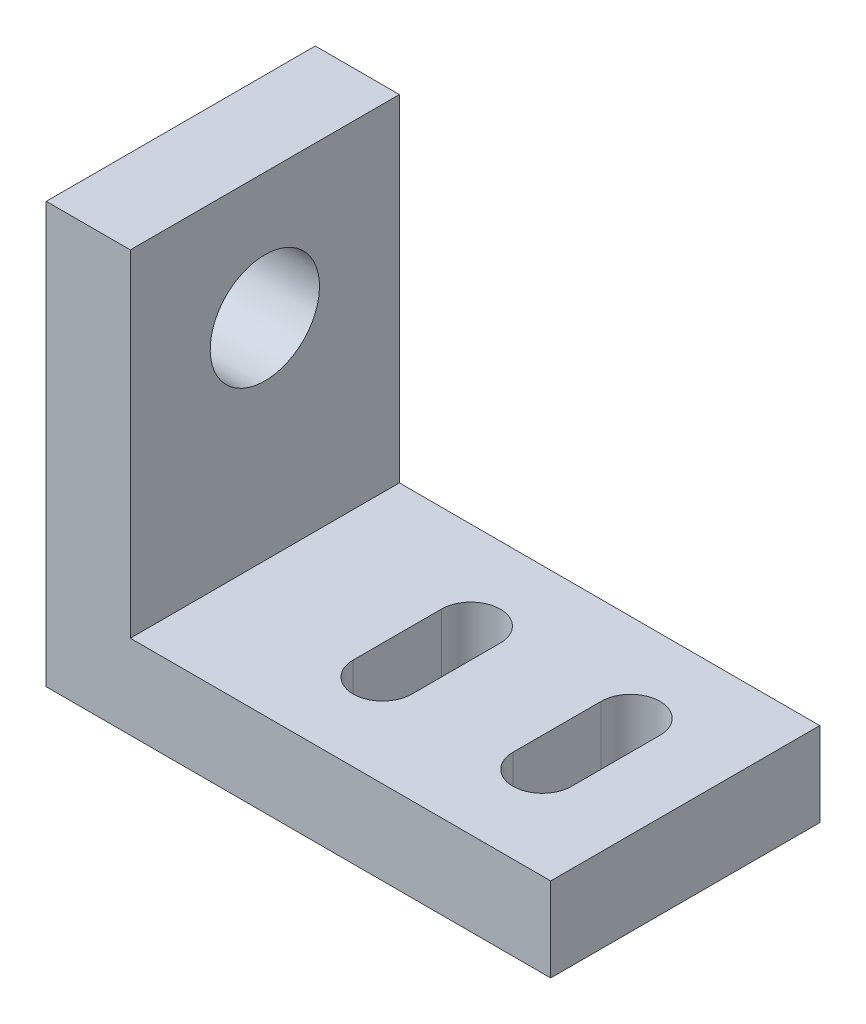
ISO-10303-21;
HEADER;
FILE_DESCRIPTION(('STEP AP214'),'2;1');
FILE_NAME('part.step','',(''),(''),'','','');
FILE_SCHEMA(('AUTOMOTIVE_DESIGN { 1 0 10303 214 1 1 1 1 }'));
ENDSEC;
DATA;
#1=APPLICATION_CONTEXT('core data for automotive mechanical design processes');
#2=APPLICATION_PROTOCOL_DEFINITION('international standard','automotive_design',2000,#1);
#3=PRODUCT_CONTEXT('',#1,'mechanical');
#4=PRODUCT('Part','Part','',(#3));
#5=PRODUCT_RELATED_PRODUCT_CATEGORY('part','',(#4));
#6=PRODUCT_DEFINITION_FORMATION('','',#4);
#7=PRODUCT_DEFINITION_CONTEXT('part definition',#1,'design');
#8=PRODUCT_DEFINITION('design','',#6,#7);
#9=PRODUCT_DEFINITION_SHAPE('','',#8);
#10=(LENGTH_UNIT() NAMED_UNIT(*) SI_UNIT(.MILLI.,.METRE.));
#11=(NAMED_UNIT(*) PLANE_ANGLE_UNIT() SI_UNIT($,.RADIAN.));
#12=(NAMED_UNIT(*) SI_UNIT($,.STERADIAN.) SOLID_ANGLE_UNIT());
#13=UNCERTAINTY_MEASURE_WITH_UNIT(LENGTH_MEASURE(1.E-05),#10,'distance_accuracy_value','');
#14=(GEOMETRIC_REPRESENTATION_CONTEXT(3) GLOBAL_UNCERTAINTY_ASSIGNED_CONTEXT((#13)) GLOBAL_UNIT_ASSIGNED_CONTEXT((#10,
#11,#12)) REPRESENTATION_CONTEXT('',''));
#15=CARTESIAN_POINT('',(0.,0.,0.));
#16=DIRECTION('',(0.,0.,1.));
#17=DIRECTION('',(1.,0.,0.));
#18=AXIS2_PLACEMENT_3D('',#15,#16,#17);
#19=CARTESIAN_POINT('',(-5.,20.,16.));
#20=DIRECTION('',(0.,-1.,0.));
#21=DIRECTION('',(1.,0.,0.));
#22=AXIS2_PLACEMENT_3D('',#19,#20,#21);
#23=PLANE('',#22);
#24=DIRECTION('',(-1.,0.,0.));
#25=VECTOR('',#24,1.);
#26=CARTESIAN_POINT('',(-5.,20.,0.));
#27=LINE('',#26,#25);
#28=CARTESIAN_POINT('',(0.,20.,0.));
#29=VERTEX_POINT('',#28);
#30=CARTESIAN_POINT('',(-5.,20.,0.));
#31=VERTEX_POINT('',#30);
#32=EDGE_CURVE('E290',#29,#31,#27,.T.);
#33=ORIENTED_EDGE('',*,*,#32,.T.);
#34=DIRECTION('',(0.,0.,-1.));
#35=VECTOR('',#34,1.);
#36=CARTESIAN_POINT('',(-5.,20.,16.));
#37=LINE('',#36,#35);
#38=CARTESIAN_POINT('',(-5.,20.,16.));
#39=VERTEX_POINT('',#38);
#40=EDGE_CURVE('E331',#39,#31,#37,.T.);
#41=ORIENTED_EDGE('',*,*,#40,.F.);
#42=DIRECTION('',(-1.,0.,0.));
#43=VECTOR('',#42,1.);
#44=CARTESIAN_POINT('',(-5.,20.,16.));
#45=LINE('',#44,#43);
#46=CARTESIAN_POINT('',(0.,20.,16.));
#47=VERTEX_POINT('',#46);
#48=EDGE_CURVE('E291',#47,#39,#45,.T.);
#49=ORIENTED_EDGE('',*,*,#48,.F.);
#50=DIRECTION('',(0.,0.,-1.));
#51=VECTOR('',#50,1.);
#52=CARTESIAN_POINT('',(0.,20.,16.));
#53=LINE('',#52,#51);
#54=EDGE_CURVE('E305',#47,#29,#53,.T.);
#55=ORIENTED_EDGE('',*,*,#54,.T.);
#56=EDGE_LOOP('',(#33,#41,#49,#55));
#57=FACE_BOUND('',#56,.T.);
#58=ADVANCED_FACE('F34',(#57),#23,.F.);
#59=CARTESIAN_POINT('',(-5.,20.,16.));
#60=DIRECTION('',(1.,0.,0.));
#61=DIRECTION('',(0.,1.,0.));
#62=AXIS2_PLACEMENT_3D('',#59,#60,#61);
#63=PLANE('',#62);
#64=CARTESIAN_POINT('',(-5.,12.5,8.));
#65=DIRECTION('',(1.,0.,0.));
#66=DIRECTION('',(0.,1.,0.));
#67=AXIS2_PLACEMENT_3D('',#64,#65,#66);
#68=CIRCLE('',#67,3.25);
#69=CARTESIAN_POINT('',(-5.,15.75,8.));
#70=VERTEX_POINT('',#69);
#71=EDGE_CURVE('E226',#70,#70,#68,.T.);
#72=ORIENTED_EDGE('',*,*,#71,.T.);
#73=EDGE_LOOP('',(#72));
#74=FACE_BOUND('',#73,.T.);
#75=DIRECTION('',(0.,-1.,0.));
#76=VECTOR('',#75,1.);
#77=CARTESIAN_POINT('',(-5.,20.,0.));
#78=LINE('',#77,#76);
#79=CARTESIAN_POINT('',(-5.,-5.,0.));
#80=VERTEX_POINT('',#79);
#81=EDGE_CURVE('E308',#31,#80,#78,.T.);
#82=ORIENTED_EDGE('',*,*,#81,.T.);
#83=DIRECTION('',(0.,0.,-1.));
#84=VECTOR('',#83,1.);
#85=CARTESIAN_POINT('',(-5.,-5.,16.));
#86=LINE('',#85,#84);
#87=CARTESIAN_POINT('',(-5.,-5.,16.));
#88=VERTEX_POINT('',#87);
#89=EDGE_CURVE('E328',#88,#80,#86,.T.);
#90=ORIENTED_EDGE('',*,*,#89,.F.);
#91=DIRECTION('',(0.,-1.,0.));
#92=VECTOR('',#91,1.);
#93=CARTESIAN_POINT('',(-5.,20.,16.));
#94=LINE('',#93,#92);
#95=EDGE_CURVE('E294',#39,#88,#94,.T.);
#96=ORIENTED_EDGE('',*,*,#95,.F.);
#97=ORIENTED_EDGE('',*,*,#40,.T.);
#98=EDGE_LOOP('',(#82,#90,#96,#97));
#99=FACE_BOUND('',#98,.T.);
#100=ADVANCED_FACE('F369',(#74,#99),#63,.F.);
#101=CARTESIAN_POINT('',(-5.,-5.,16.));
#102=DIRECTION('',(0.,1.,0.));
#103=DIRECTION('',(0.,0.,1.));
#104=AXIS2_PLACEMENT_3D('',#101,#102,#103);
#105=PLANE('',#104);
#106=DIRECTION('',(0.,0.,-1.));
#107=VECTOR('',#106,1.);
#108=CARTESIAN_POINT('',(20.7694812656682,-5.,16.));
#109=LINE('',#108,#107);
#110=CARTESIAN_POINT('',(20.7694812656682,-5.,10.5));
#111=VERTEX_POINT('',#110);
#112=CARTESIAN_POINT('',(20.7694812656682,-5.,5.25));
#113=VERTEX_POINT('',#112);
#114=EDGE_CURVE('E41',#111,#113,#109,.T.);
#115=ORIENTED_EDGE('',*,*,#114,.T.);
#116=CARTESIAN_POINT('',(19.0004993468507,-5.,5.25));
#117=DIRECTION('',(0.,1.,0.));
#118=DIRECTION('',(0.,0.,1.));
#119=AXIS2_PLACEMENT_3D('',#116,#117,#118);
#120=CIRCLE('',#119,1.76898191881743);
#121=CARTESIAN_POINT('',(17.2315174280333,-5.,5.25));
#122=VERTEX_POINT('',#121);
#123=EDGE_CURVE('E11',#113,#122,#120,.T.);
#124=ORIENTED_EDGE('',*,*,#123,.T.);
#125=DIRECTION('',(0.,0.,1.));
#126=VECTOR('',#125,1.);
#127=CARTESIAN_POINT('',(17.2315174280333,-5.,16.));
#128=LINE('',#127,#126);
#129=CARTESIAN_POINT('',(17.2315174280333,-5.,10.5));
#130=VERTEX_POINT('',#129);
#131=EDGE_CURVE('E185',#122,#130,#128,.T.);
#132=ORIENTED_EDGE('',*,*,#131,.T.);
#133=CARTESIAN_POINT('',(19.0004993468507,-5.,10.5));
#134=DIRECTION('',(0.,1.,0.));
#135=DIRECTION('',(0.,0.,1.));
#136=AXIS2_PLACEMENT_3D('',#133,#134,#135);
#137=CIRCLE('',#136,1.76898191881743);
#138=EDGE_CURVE('E349',#130,#111,#137,.T.);
#139=ORIENTED_EDGE('',*,*,#138,.T.);
#140=EDGE_LOOP('',(#115,#124,#132,#139));
#141=FACE_BOUND('',#140,.T.);
#142=DIRECTION('',(0.,0.,-1.));
#143=VECTOR('',#142,1.);
#144=CARTESIAN_POINT('',(11.2689819188174,-5.,16.));
#145=LINE('',#144,#143);
#146=CARTESIAN_POINT('',(11.2689819188174,-5.,10.5));
#147=VERTEX_POINT('',#146);
#148=CARTESIAN_POINT('',(11.2689819188174,-5.,5.25));
#149=VERTEX_POINT('',#148);
#150=EDGE_CURVE('E342',#147,#149,#145,.T.);
#151=ORIENTED_EDGE('',*,*,#150,.T.);
#152=CARTESIAN_POINT('',(9.5,-5.,5.25));
#153=DIRECTION('',(0.,1.,0.));
#154=DIRECTION('',(0.,0.,1.));
#155=AXIS2_PLACEMENT_3D('',#152,#153,#154);
#156=CIRCLE('',#155,1.76898191881743);
#157=CARTESIAN_POINT('',(7.73101808118257,-5.,5.25));
#158=VERTEX_POINT('',#157);
#159=EDGE_CURVE('E345',#149,#158,#156,.T.);
#160=ORIENTED_EDGE('',*,*,#159,.T.);
#161=DIRECTION('',(0.,0.,1.));
#162=VECTOR('',#161,1.);
#163=CARTESIAN_POINT('',(7.73101808118257,-5.,16.));
#164=LINE('',#163,#162);
#165=CARTESIAN_POINT('',(7.73101808118257,-5.,10.5));
#166=VERTEX_POINT('',#165);
#167=EDGE_CURVE('E334',#158,#166,#164,.T.);
#168=ORIENTED_EDGE('',*,*,#167,.T.);
#169=CARTESIAN_POINT('',(9.5,-5.,10.5));
#170=DIRECTION('',(0.,1.,0.));
#171=DIRECTION('',(0.,0.,1.));
#172=AXIS2_PLACEMENT_3D('',#169,#170,#171);
#173=CIRCLE('',#172,1.76898191881743);
#174=EDGE_CURVE('E339',#166,#147,#173,.T.);
#175=ORIENTED_EDGE('',*,*,#174,.T.);
#176=EDGE_LOOP('',(#151,#160,#168,#175));
#177=FACE_BOUND('',#176,.T.);
#178=DIRECTION('',(1.,0.,0.));
#179=VECTOR('',#178,1.);
#180=CARTESIAN_POINT('',(-5.,-5.,0.));
#181=LINE('',#180,#179);
#182=CARTESIAN_POINT('',(25.,-5.,0.));
#183=VERTEX_POINT('',#182);
#184=EDGE_CURVE('E310',#80,#183,#181,.T.);
#185=ORIENTED_EDGE('',*,*,#184,.T.);
#186=DIRECTION('',(0.,0.,-1.));
#187=VECTOR('',#186,1.);
#188=CARTESIAN_POINT('',(25.,-5.,16.));
#189=LINE('',#188,#187);
#190=CARTESIAN_POINT('',(25.,-5.,16.));
#191=VERTEX_POINT('',#190);
#192=EDGE_CURVE('E325',#191,#183,#189,.T.);
#193=ORIENTED_EDGE('',*,*,#192,.F.);
#194=DIRECTION('',(1.,0.,0.));
#195=VECTOR('',#194,1.);
#196=CARTESIAN_POINT('',(-5.,-5.,16.));
#197=LINE('',#196,#195);
#198=EDGE_CURVE('E297',#88,#191,#197,.T.);
#199=ORIENTED_EDGE('',*,*,#198,.F.);
#200=ORIENTED_EDGE('',*,*,#89,.T.);
#201=EDGE_LOOP('',(#185,#193,#199,#200));
#202=FACE_BOUND('',#201,.T.);
#203=ADVANCED_FACE('F353',(#141,#177,#202),#105,.F.);
#204=CARTESIAN_POINT('',(25.,0.,16.));
#205=DIRECTION('',(-1.,0.,0.));
#206=DIRECTION('',(0.,0.,1.));
#207=AXIS2_PLACEMENT_3D('',#204,#205,#206);
#208=PLANE('',#207);
#209=DIRECTION('',(0.,1.,0.));
#210=VECTOR('',#209,1.);
#211=CARTESIAN_POINT('',(25.,0.,0.));
#212=LINE('',#211,#210);
#213=CARTESIAN_POINT('',(25.,0.,0.));
#214=VERTEX_POINT('',#213);
#215=EDGE_CURVE('E312',#183,#214,#212,.T.);
#216=ORIENTED_EDGE('',*,*,#215,.T.);
#217=DIRECTION('',(0.,0.,-1.));
#218=VECTOR('',#217,1.);
#219=CARTESIAN_POINT('',(25.,0.,16.));
#220=LINE('',#219,#218);
#221=CARTESIAN_POINT('',(25.,0.,16.));
#222=VERTEX_POINT('',#221);
#223=EDGE_CURVE('E322',#222,#214,#220,.T.);
#224=ORIENTED_EDGE('',*,*,#223,.F.);
#225=DIRECTION('',(0.,1.,0.));
#226=VECTOR('',#225,1.);
#227=CARTESIAN_POINT('',(25.,0.,16.));
#228=LINE('',#227,#226);
#229=EDGE_CURVE('E299',#191,#222,#228,.T.);
#230=ORIENTED_EDGE('',*,*,#229,.F.);
#231=ORIENTED_EDGE('',*,*,#192,.T.);
#232=EDGE_LOOP('',(#216,#224,#230,#231));
#233=FACE_BOUND('',#232,.T.);
#234=ADVANCED_FACE('F399',(#233),#208,.F.);
#235=CARTESIAN_POINT('',(0.,0.,16.));
#236=DIRECTION('',(0.,-1.,0.));
#237=DIRECTION('',(1.,0.,0.));
#238=AXIS2_PLACEMENT_3D('',#235,#236,#237);
#239=PLANE('',#238);
#240=DIRECTION('',(0.,0.,1.));
#241=VECTOR('',#240,1.);
#242=CARTESIAN_POINT('',(17.25,0.,5.25));
#243=LINE('',#242,#241);
#244=CARTESIAN_POINT('',(17.25,0.,5.25));
#245=VERTEX_POINT('',#244);
#246=CARTESIAN_POINT('',(17.25,0.,10.5));
#247=VERTEX_POINT('',#246);
#248=EDGE_CURVE('E243',#245,#247,#243,.T.);
#249=ORIENTED_EDGE('',*,*,#248,.F.);
#250=CARTESIAN_POINT('',(19.,0.,5.25));
#251=DIRECTION('',(0.,1.,0.));
#252=DIRECTION('',(-1.,0.,0.));
#253=AXIS2_PLACEMENT_3D('',#250,#251,#252);
#254=CIRCLE('',#253,1.75);
#255=CARTESIAN_POINT('',(20.75,0.,5.25));
#256=VERTEX_POINT('',#255);
#257=EDGE_CURVE('E241',#256,#245,#254,.T.);
#258=ORIENTED_EDGE('',*,*,#257,.F.);
#259=DIRECTION('',(0.,0.,-1.));
#260=VECTOR('',#259,1.);
#261=CARTESIAN_POINT('',(20.75,0.,5.25));
#262=LINE('',#261,#260);
#263=CARTESIAN_POINT('',(20.75,0.,10.5));
#264=VERTEX_POINT('',#263);
#265=EDGE_CURVE('E234',#264,#256,#262,.T.);
#266=ORIENTED_EDGE('',*,*,#265,.F.);
#267=CARTESIAN_POINT('',(19.,0.,10.5));
#268=DIRECTION('',(0.,1.,0.));
#269=DIRECTION('',(-1.,0.,0.));
#270=AXIS2_PLACEMENT_3D('',#267,#268,#269);
#271=CIRCLE('',#270,1.75);
#272=EDGE_CURVE('E246',#247,#264,#271,.T.);
#273=ORIENTED_EDGE('',*,*,#272,.F.);
#274=EDGE_LOOP('',(#249,#258,#266,#273));
#275=FACE_BOUND('',#274,.T.);
#276=DIRECTION('',(0.,0.,1.));
#277=VECTOR('',#276,1.);
#278=CARTESIAN_POINT('',(7.75,0.,5.25));
#279=LINE('',#278,#277);
#280=CARTESIAN_POINT('',(7.75,0.,5.25));
#281=VERTEX_POINT('',#280);
#282=CARTESIAN_POINT('',(7.75,0.,10.5));
#283=VERTEX_POINT('',#282);
#284=EDGE_CURVE('E271',#281,#283,#279,.T.);
#285=ORIENTED_EDGE('',*,*,#284,.F.);
#286=CARTESIAN_POINT('',(9.5,0.,5.25));
#287=DIRECTION('',(0.,1.,0.));
#288=DIRECTION('',(-1.,0.,0.));
#289=AXIS2_PLACEMENT_3D('',#286,#287,#288);
#290=CIRCLE('',#289,1.75);
#291=CARTESIAN_POINT('',(11.25,0.,5.25));
#292=VERTEX_POINT('',#291);
#293=EDGE_CURVE('E253',#292,#281,#290,.T.);
#294=ORIENTED_EDGE('',*,*,#293,.F.);
#295=DIRECTION('',(0.,0.,-1.));
#296=VECTOR('',#295,1.);
#297=CARTESIAN_POINT('',(11.25,0.,5.25));
#298=LINE('',#297,#296);
#299=CARTESIAN_POINT('',(11.25,0.,10.5));
#300=VERTEX_POINT('',#299);
#301=EDGE_CURVE('E263',#300,#292,#298,.T.);
#302=ORIENTED_EDGE('',*,*,#301,.F.);
#303=CARTESIAN_POINT('',(9.5,0.,10.5));
#304=DIRECTION('',(0.,1.,0.));
#305=DIRECTION('',(-1.,0.,0.));
#306=AXIS2_PLACEMENT_3D('',#303,#304,#305);
#307=CIRCLE('',#306,1.75);
#308=EDGE_CURVE('E274',#283,#300,#307,.T.);
#309=ORIENTED_EDGE('',*,*,#308,.F.);
#310=EDGE_LOOP('',(#285,#294,#302,#309));
#311=FACE_BOUND('',#310,.T.);
#312=DIRECTION('',(-1.,0.,0.));
#313=VECTOR('',#312,1.);
#314=CARTESIAN_POINT('',(0.,0.,0.));
#315=LINE('',#314,#313);
#316=CARTESIAN_POINT('',(0.,0.,0.));
#317=VERTEX_POINT('',#316);
#318=EDGE_CURVE('E314',#214,#317,#315,.T.);
#319=ORIENTED_EDGE('',*,*,#318,.T.);
#320=DIRECTION('',(0.,0.,-1.));
#321=VECTOR('',#320,1.);
#322=CARTESIAN_POINT('',(0.,0.,16.));
#323=LINE('',#322,#321);
#324=CARTESIAN_POINT('',(0.,0.,16.));
#325=VERTEX_POINT('',#324);
#326=EDGE_CURVE('E319',#325,#317,#323,.T.);
#327=ORIENTED_EDGE('',*,*,#326,.F.);
#328=DIRECTION('',(-1.,0.,0.));
#329=VECTOR('',#328,1.);
#330=CARTESIAN_POINT('',(0.,0.,16.));
#331=LINE('',#330,#329);
#332=EDGE_CURVE('E301',#222,#325,#331,.T.);
#333=ORIENTED_EDGE('',*,*,#332,.F.);
#334=ORIENTED_EDGE('',*,*,#223,.T.);
#335=EDGE_LOOP('',(#319,#327,#333,#334));
#336=FACE_BOUND('',#335,.T.);
#337=ADVANCED_FACE('F396',(#275,#311,#336),#239,.F.);
#338=CARTESIAN_POINT('',(0.,20.,16.));
#339=DIRECTION('',(-1.,0.,0.));
#340=DIRECTION('',(0.,-1.,0.));
#341=AXIS2_PLACEMENT_3D('',#338,#339,#340);
#342=PLANE('',#341);
#343=CARTESIAN_POINT('',(0.,12.5,8.));
#344=DIRECTION('',(1.,0.,0.));
#345=DIRECTION('',(0.,1.,0.));
#346=AXIS2_PLACEMENT_3D('',#343,#344,#345);
#347=CIRCLE('',#346,3.25);
#348=CARTESIAN_POINT('',(0.,15.75,8.));
#349=VERTEX_POINT('',#348);
#350=EDGE_CURVE('E281',#349,#349,#347,.T.);
#351=ORIENTED_EDGE('',*,*,#350,.F.);
#352=EDGE_LOOP('',(#351));
#353=FACE_BOUND('',#352,.T.);
#354=DIRECTION('',(0.,1.,0.));
#355=VECTOR('',#354,1.);
#356=CARTESIAN_POINT('',(0.,20.,0.));
#357=LINE('',#356,#355);
#358=EDGE_CURVE('E295',#317,#29,#357,.T.);
#359=ORIENTED_EDGE('',*,*,#358,.T.);
#360=ORIENTED_EDGE('',*,*,#54,.F.);
#361=DIRECTION('',(0.,1.,0.));
#362=VECTOR('',#361,1.);
#363=CARTESIAN_POINT('',(0.,20.,16.));
#364=LINE('',#363,#362);
#365=EDGE_CURVE('E303',#325,#47,#364,.T.);
#366=ORIENTED_EDGE('',*,*,#365,.F.);
#367=ORIENTED_EDGE('',*,*,#326,.T.);
#368=EDGE_LOOP('',(#359,#360,#366,#367));
#369=FACE_BOUND('',#368,.T.);
#370=ADVANCED_FACE('F394',(#353,#369),#342,.F.);
#371=CARTESIAN_POINT('',(0.,0.,16.));
#372=DIRECTION('',(0.,0.,-1.));
#373=DIRECTION('',(-1.,0.,0.));
#374=AXIS2_PLACEMENT_3D('',#371,#372,#373);
#375=PLANE('',#374);
#376=ORIENTED_EDGE('',*,*,#48,.T.);
#377=ORIENTED_EDGE('',*,*,#95,.T.);
#378=ORIENTED_EDGE('',*,*,#198,.T.);
#379=ORIENTED_EDGE('',*,*,#229,.T.);
#380=ORIENTED_EDGE('',*,*,#332,.T.);
#381=ORIENTED_EDGE('',*,*,#365,.T.);
#382=EDGE_LOOP('',(#376,#377,#378,#379,#380,#381));
#383=FACE_BOUND('',#382,.T.);
#384=ADVANCED_FACE('F389',(#383),#375,.F.);
#385=CARTESIAN_POINT('',(0.,0.,0.));
#386=DIRECTION('',(0.,0.,-1.));
#387=DIRECTION('',(-1.,0.,0.));
#388=AXIS2_PLACEMENT_3D('',#385,#386,#387);
#389=PLANE('',#388);
#390=ORIENTED_EDGE('',*,*,#32,.F.);
#391=ORIENTED_EDGE('',*,*,#358,.F.);
#392=ORIENTED_EDGE('',*,*,#318,.F.);
#393=ORIENTED_EDGE('',*,*,#215,.F.);
#394=ORIENTED_EDGE('',*,*,#184,.F.);
#395=ORIENTED_EDGE('',*,*,#81,.F.);
#396=EDGE_LOOP('',(#390,#391,#392,#393,#394,#395));
#397=FACE_BOUND('',#396,.T.);
#398=ADVANCED_FACE('F381',(#397),#389,.T.);
#399=CARTESIAN_POINT('',(-4.,12.5,8.));
#400=DIRECTION('',(1.,0.,0.));
#401=DIRECTION('',(0.,1.,0.));
#402=AXIS2_PLACEMENT_3D('',#399,#400,#401);
#403=CYLINDRICAL_SURFACE('',#402,3.25);
#404=ORIENTED_EDGE('',*,*,#350,.T.);
#405=EDGE_LOOP('',(#404));
#406=FACE_BOUND('',#405,.T.);
#407=ORIENTED_EDGE('',*,*,#71,.F.);
#408=EDGE_LOOP('',(#407));
#409=FACE_BOUND('',#408,.T.);
#410=ADVANCED_FACE('F418',(#406,#409),#403,.F.);
#411=CARTESIAN_POINT('',(9.5,-4.,5.25));
#412=DIRECTION('',(0.,1.,0.));
#413=DIRECTION('',(-1.,0.,0.));
#414=AXIS2_PLACEMENT_3D('',#411,#412,#413);
#415=CYLINDRICAL_SURFACE('',#414,1.75);
#416=ORIENTED_EDGE('',*,*,#293,.T.);
#417=DIRECTION('',(0.,1.,0.));
#418=VECTOR('',#417,1.);
#419=CARTESIAN_POINT('',(7.75,-4.,5.25));
#420=LINE('',#419,#418);
#421=CARTESIAN_POINT('',(7.75,-4.,5.25));
#422=VERTEX_POINT('',#421);
#423=EDGE_CURVE('E269',#422,#281,#420,.T.);
#424=ORIENTED_EDGE('',*,*,#423,.F.);
#425=CARTESIAN_POINT('',(9.5,-4.,5.25));
#426=DIRECTION('',(0.,1.,0.));
#427=DIRECTION('',(-1.,0.,0.));
#428=AXIS2_PLACEMENT_3D('',#425,#426,#427);
#429=CIRCLE('',#428,1.75);
#430=CARTESIAN_POINT('',(11.25,-4.,5.25));
#431=VERTEX_POINT('',#430);
#432=EDGE_CURVE('E260',#431,#422,#429,.T.);
#433=ORIENTED_EDGE('',*,*,#432,.F.);
#434=DIRECTION('',(0.,1.,0.));
#435=VECTOR('',#434,1.);
#436=CARTESIAN_POINT('',(11.25,-4.,5.25));
#437=LINE('',#436,#435);
#438=EDGE_CURVE('E279',#431,#292,#437,.T.);
#439=ORIENTED_EDGE('',*,*,#438,.T.);
#440=EDGE_LOOP('',(#416,#424,#433,#439));
#441=FACE_BOUND('',#440,.T.);
#442=ADVANCED_FACE('F423',(#441),#415,.F.);
#443=CARTESIAN_POINT('',(11.25,-4.,5.25));
#444=DIRECTION('',(1.,0.,0.));
#445=DIRECTION('',(0.,1.,0.));
#446=AXIS2_PLACEMENT_3D('',#443,#444,#445);
#447=PLANE('',#446);
#448=ORIENTED_EDGE('',*,*,#301,.T.);
#449=ORIENTED_EDGE('',*,*,#438,.F.);
#450=DIRECTION('',(0.,0.,-1.));
#451=VECTOR('',#450,1.);
#452=CARTESIAN_POINT('',(11.25,-4.,5.25));
#453=LINE('',#452,#451);
#454=CARTESIAN_POINT('',(11.25,-4.,10.5));
#455=VERTEX_POINT('',#454);
#456=EDGE_CURVE('E267',#455,#431,#453,.T.);
#457=ORIENTED_EDGE('',*,*,#456,.F.);
#458=DIRECTION('',(0.,1.,0.));
#459=VECTOR('',#458,1.);
#460=CARTESIAN_POINT('',(11.25,-4.,10.5));
#461=LINE('',#460,#459);
#462=EDGE_CURVE('E282',#455,#300,#461,.T.);
#463=ORIENTED_EDGE('',*,*,#462,.T.);
#464=EDGE_LOOP('',(#448,#449,#457,#463));
#465=FACE_BOUND('',#464,.T.);
#466=ADVANCED_FACE('F427',(#465),#447,.F.);
#467=CARTESIAN_POINT('',(9.5,-4.,10.5));
#468=DIRECTION('',(0.,1.,0.));
#469=DIRECTION('',(-1.,0.,0.));
#470=AXIS2_PLACEMENT_3D('',#467,#468,#469);
#471=CYLINDRICAL_SURFACE('',#470,1.75);
#472=ORIENTED_EDGE('',*,*,#308,.T.);
#473=ORIENTED_EDGE('',*,*,#462,.F.);
#474=CARTESIAN_POINT('',(9.5,-4.,10.5));
#475=DIRECTION('',(0.,1.,0.));
#476=DIRECTION('',(-1.,0.,0.));
#477=AXIS2_PLACEMENT_3D('',#474,#475,#476);
#478=CIRCLE('',#477,1.75);
#479=CARTESIAN_POINT('',(7.75,-4.,10.5));
#480=VERTEX_POINT('',#479);
#481=EDGE_CURVE('E265',#480,#455,#478,.T.);
#482=ORIENTED_EDGE('',*,*,#481,.F.);
#483=DIRECTION('',(0.,1.,0.));
#484=VECTOR('',#483,1.);
#485=CARTESIAN_POINT('',(7.75,-4.,10.5));
#486=LINE('',#485,#484);
#487=EDGE_CURVE('E284',#480,#283,#486,.T.);
#488=ORIENTED_EDGE('',*,*,#487,.T.);
#489=EDGE_LOOP('',(#472,#473,#482,#488));
#490=FACE_BOUND('',#489,.T.);
#491=ADVANCED_FACE('F433',(#490),#471,.F.);
#492=CARTESIAN_POINT('',(7.75,-4.,5.25));
#493=DIRECTION('',(-1.,0.,0.));
#494=DIRECTION('',(0.,-1.,0.));
#495=AXIS2_PLACEMENT_3D('',#492,#493,#494);
#496=PLANE('',#495);
#497=ORIENTED_EDGE('',*,*,#284,.T.);
#498=ORIENTED_EDGE('',*,*,#487,.F.);
#499=DIRECTION('',(0.,0.,1.));
#500=VECTOR('',#499,1.);
#501=CARTESIAN_POINT('',(7.75,-4.,5.25));
#502=LINE('',#501,#500);
#503=EDGE_CURVE('E262',#422,#480,#502,.T.);
#504=ORIENTED_EDGE('',*,*,#503,.F.);
#505=ORIENTED_EDGE('',*,*,#423,.T.);
#506=EDGE_LOOP('',(#497,#498,#504,#505));
#507=FACE_BOUND('',#506,.T.);
#508=ADVANCED_FACE('F429',(#507),#496,.F.);
#509=CARTESIAN_POINT('',(19.,-4.,5.25));
#510=DIRECTION('',(0.,1.,0.));
#511=DIRECTION('',(-1.,0.,0.));
#512=AXIS2_PLACEMENT_3D('',#509,#510,#511);
#513=CYLINDRICAL_SURFACE('',#512,1.75);
#514=ORIENTED_EDGE('',*,*,#257,.T.);
#515=DIRECTION('',(0.,1.,0.));
#516=VECTOR('',#515,1.);
#517=CARTESIAN_POINT('',(17.25,-4.,5.25));
#518=LINE('',#517,#516);
#519=CARTESIAN_POINT('',(17.25,-4.,5.25));
#520=VERTEX_POINT('',#519);
#521=EDGE_CURVE('E240',#520,#245,#518,.T.);
#522=ORIENTED_EDGE('',*,*,#521,.F.);
#523=CARTESIAN_POINT('',(19.,-4.,5.25));
#524=DIRECTION('',(0.,1.,0.));
#525=DIRECTION('',(-1.,0.,0.));
#526=AXIS2_PLACEMENT_3D('',#523,#524,#525);
#527=CIRCLE('',#526,1.75);
#528=CARTESIAN_POINT('',(20.75,-4.,5.25));
#529=VERTEX_POINT('',#528);
#530=EDGE_CURVE('E231',#529,#520,#527,.T.);
#531=ORIENTED_EDGE('',*,*,#530,.F.);
#532=DIRECTION('',(0.,1.,0.));
#533=VECTOR('',#532,1.);
#534=CARTESIAN_POINT('',(20.75,-4.,5.25));
#535=LINE('',#534,#533);
#536=EDGE_CURVE('E251',#529,#256,#535,.T.);
#537=ORIENTED_EDGE('',*,*,#536,.T.);
#538=EDGE_LOOP('',(#514,#522,#531,#537));
#539=FACE_BOUND('',#538,.T.);
#540=ADVANCED_FACE('F432',(#539),#513,.F.);
#541=CARTESIAN_POINT('',(20.75,-4.,5.25));
#542=DIRECTION('',(1.,0.,0.));
#543=DIRECTION('',(0.,1.,0.));
#544=AXIS2_PLACEMENT_3D('',#541,#542,#543);
#545=PLANE('',#544);
#546=ORIENTED_EDGE('',*,*,#265,.T.);
#547=ORIENTED_EDGE('',*,*,#536,.F.);
#548=DIRECTION('',(0.,0.,-1.));
#549=VECTOR('',#548,1.);
#550=CARTESIAN_POINT('',(20.75,-4.,5.25));
#551=LINE('',#550,#549);
#552=CARTESIAN_POINT('',(20.75,-4.,10.5));
#553=VERTEX_POINT('',#552);
#554=EDGE_CURVE('E238',#553,#529,#551,.T.);
#555=ORIENTED_EDGE('',*,*,#554,.F.);
#556=DIRECTION('',(0.,1.,0.));
#557=VECTOR('',#556,1.);
#558=CARTESIAN_POINT('',(20.75,-4.,10.5));
#559=LINE('',#558,#557);
#560=EDGE_CURVE('E254',#553,#264,#559,.T.);
#561=ORIENTED_EDGE('',*,*,#560,.T.);
#562=EDGE_LOOP('',(#546,#547,#555,#561));
#563=FACE_BOUND('',#562,.T.);
#564=ADVANCED_FACE('F443',(#563),#545,.F.);
#565=CARTESIAN_POINT('',(19.,-4.,10.5));
#566=DIRECTION('',(0.,1.,0.));
#567=DIRECTION('',(-1.,0.,0.));
#568=AXIS2_PLACEMENT_3D('',#565,#566,#567);
#569=CYLINDRICAL_SURFACE('',#568,1.75);
#570=ORIENTED_EDGE('',*,*,#272,.T.);
#571=ORIENTED_EDGE('',*,*,#560,.F.);
#572=CARTESIAN_POINT('',(19.,-4.,10.5));
#573=DIRECTION('',(0.,1.,0.));
#574=DIRECTION('',(-1.,0.,0.));
#575=AXIS2_PLACEMENT_3D('',#572,#573,#574);
#576=CIRCLE('',#575,1.75);
#577=CARTESIAN_POINT('',(17.25,-4.,10.5));
#578=VERTEX_POINT('',#577);
#579=EDGE_CURVE('E236',#578,#553,#576,.T.);
#580=ORIENTED_EDGE('',*,*,#579,.F.);
#581=DIRECTION('',(0.,1.,0.));
#582=VECTOR('',#581,1.);
#583=CARTESIAN_POINT('',(17.25,-4.,10.5));
#584=LINE('',#583,#582);
#585=EDGE_CURVE('E256',#578,#247,#584,.T.);
#586=ORIENTED_EDGE('',*,*,#585,.T.);
#587=EDGE_LOOP('',(#570,#571,#580,#586));
#588=FACE_BOUND('',#587,.T.);
#589=ADVANCED_FACE('F449',(#588),#569,.F.);
#590=CARTESIAN_POINT('',(17.25,-4.,5.25));
#591=DIRECTION('',(-1.,0.,0.));
#592=DIRECTION('',(0.,-1.,0.));
#593=AXIS2_PLACEMENT_3D('',#590,#591,#592);
#594=PLANE('',#593);
#595=ORIENTED_EDGE('',*,*,#248,.T.);
#596=ORIENTED_EDGE('',*,*,#585,.F.);
#597=DIRECTION('',(0.,0.,1.));
#598=VECTOR('',#597,1.);
#599=CARTESIAN_POINT('',(17.25,-4.,5.25));
#600=LINE('',#599,#598);
#601=EDGE_CURVE('E233',#520,#578,#600,.T.);
#602=ORIENTED_EDGE('',*,*,#601,.F.);
#603=ORIENTED_EDGE('',*,*,#521,.T.);
#604=EDGE_LOOP('',(#595,#596,#602,#603));
#605=FACE_BOUND('',#604,.T.);
#606=ADVANCED_FACE('F445',(#605),#594,.F.);
#607=CARTESIAN_POINT('',(9.5,-7.,5.25));
#608=DIRECTION('',(0.,1.,0.));
#609=DIRECTION('',(-1.,0.,0.));
#610=AXIS2_PLACEMENT_3D('',#607,#608,#609);
#611=CYLINDRICAL_SURFACE('',#610,1.76898191881743);
#612=DIRECTION('',(0.,1.,0.));
#613=VECTOR('',#612,1.);
#614=CARTESIAN_POINT('',(11.2689819188174,-7.,5.25));
#615=LINE('',#614,#613);
#616=CARTESIAN_POINT('',(11.2689819188174,-4.,5.25));
#617=VERTEX_POINT('',#616);
#618=EDGE_CURVE('E224',#149,#617,#615,.T.);
#619=ORIENTED_EDGE('',*,*,#618,.T.);
#620=CARTESIAN_POINT('',(9.5,-4.,5.25));
#621=DIRECTION('',(0.,1.,0.));
#622=DIRECTION('',(-1.,0.,0.));
#623=AXIS2_PLACEMENT_3D('',#620,#621,#622);
#624=CIRCLE('',#623,1.76898191881743);
#625=CARTESIAN_POINT('',(7.73101808118257,-4.,5.25));
#626=VERTEX_POINT('',#625);
#627=EDGE_CURVE('E209',#617,#626,#624,.T.);
#628=ORIENTED_EDGE('',*,*,#627,.T.);
#629=DIRECTION('',(0.,1.,0.));
#630=VECTOR('',#629,1.);
#631=CARTESIAN_POINT('',(7.73101808118257,-7.,5.25));
#632=LINE('',#631,#630);
#633=EDGE_CURVE('E223',#158,#626,#632,.T.);
#634=ORIENTED_EDGE('',*,*,#633,.F.);
#635=ORIENTED_EDGE('',*,*,#159,.F.);
#636=EDGE_LOOP('',(#619,#628,#634,#635));
#637=FACE_BOUND('',#636,.T.);
#638=ADVANCED_FACE('F448',(#637),#611,.F.);
#639=CARTESIAN_POINT('',(11.2689819188174,-7.,5.25));
#640=DIRECTION('',(1.,0.,0.));
#641=DIRECTION('',(0.,1.,0.));
#642=AXIS2_PLACEMENT_3D('',#639,#640,#641);
#643=PLANE('',#642);
#644=DIRECTION('',(0.,1.,0.));
#645=VECTOR('',#644,1.);
#646=CARTESIAN_POINT('',(11.2689819188174,-7.,10.5));
#647=LINE('',#646,#645);
#648=CARTESIAN_POINT('',(11.2689819188174,-4.,10.5));
#649=VERTEX_POINT('',#648);
#650=EDGE_CURVE('E227',#147,#649,#647,.T.);
#651=ORIENTED_EDGE('',*,*,#650,.T.);
#652=DIRECTION('',(0.,0.,-1.));
#653=VECTOR('',#652,1.);
#654=CARTESIAN_POINT('',(11.2689819188174,-4.,5.25));
#655=LINE('',#654,#653);
#656=EDGE_CURVE('E220',#649,#617,#655,.T.);
#657=ORIENTED_EDGE('',*,*,#656,.T.);
#658=ORIENTED_EDGE('',*,*,#618,.F.);
#659=ORIENTED_EDGE('',*,*,#150,.F.);
#660=EDGE_LOOP('',(#651,#657,#658,#659));
#661=FACE_BOUND('',#660,.T.);
#662=ADVANCED_FACE('F459',(#661),#643,.F.);
#663=CARTESIAN_POINT('',(9.5,-7.,10.5));
#664=DIRECTION('',(0.,1.,0.));
#665=DIRECTION('',(-1.,0.,0.));
#666=AXIS2_PLACEMENT_3D('',#663,#664,#665);
#667=CYLINDRICAL_SURFACE('',#666,1.76898191881743);
#668=DIRECTION('',(0.,1.,0.));
#669=VECTOR('',#668,1.);
#670=CARTESIAN_POINT('',(7.73101808118257,-7.,10.5));
#671=LINE('',#670,#669);
#672=CARTESIAN_POINT('',(7.73101808118257,-4.,10.5));
#673=VERTEX_POINT('',#672);
#674=EDGE_CURVE('E56',#166,#673,#671,.T.);
#675=ORIENTED_EDGE('',*,*,#674,.T.);
#676=CARTESIAN_POINT('',(9.5,-4.,10.5));
#677=DIRECTION('',(0.,1.,0.));
#678=DIRECTION('',(-1.,0.,0.));
#679=AXIS2_PLACEMENT_3D('',#676,#677,#678);
#680=CIRCLE('',#679,1.76898191881743);
#681=EDGE_CURVE('E217',#673,#649,#680,.T.);
#682=ORIENTED_EDGE('',*,*,#681,.T.);
#683=ORIENTED_EDGE('',*,*,#650,.F.);
#684=ORIENTED_EDGE('',*,*,#174,.F.);
#685=EDGE_LOOP('',(#675,#682,#683,#684));
#686=FACE_BOUND('',#685,.T.);
#687=ADVANCED_FACE('F465',(#686),#667,.F.);
#688=CARTESIAN_POINT('',(7.73101808118257,-7.,5.25));
#689=DIRECTION('',(-1.,0.,0.));
#690=DIRECTION('',(0.,-1.,0.));
#691=AXIS2_PLACEMENT_3D('',#688,#689,#690);
#692=PLANE('',#691);
#693=ORIENTED_EDGE('',*,*,#633,.T.);
#694=DIRECTION('',(0.,0.,1.));
#695=VECTOR('',#694,1.);
#696=CARTESIAN_POINT('',(7.73101808118257,-4.,5.25));
#697=LINE('',#696,#695);
#698=EDGE_CURVE('E215',#626,#673,#697,.T.);
#699=ORIENTED_EDGE('',*,*,#698,.T.);
#700=ORIENTED_EDGE('',*,*,#674,.F.);
#701=ORIENTED_EDGE('',*,*,#167,.F.);
#702=EDGE_LOOP('',(#693,#699,#700,#701));
#703=FACE_BOUND('',#702,.T.);
#704=ADVANCED_FACE('F461',(#703),#692,.F.);
#705=CARTESIAN_POINT('',(9.5,-4.,5.25));
#706=DIRECTION('',(0.,1.,0.));
#707=DIRECTION('',(-1.,0.,0.));
#708=AXIS2_PLACEMENT_3D('',#705,#706,#707);
#709=PLANE('',#708);
#710=ORIENTED_EDGE('',*,*,#627,.F.);
#711=ORIENTED_EDGE('',*,*,#656,.F.);
#712=ORIENTED_EDGE('',*,*,#681,.F.);
#713=ORIENTED_EDGE('',*,*,#698,.F.);
#714=EDGE_LOOP('',(#710,#711,#712,#713));
#715=FACE_BOUND('',#714,.T.);
#716=ORIENTED_EDGE('',*,*,#503,.T.);
#717=ORIENTED_EDGE('',*,*,#481,.T.);
#718=ORIENTED_EDGE('',*,*,#456,.T.);
#719=ORIENTED_EDGE('',*,*,#432,.T.);
#720=EDGE_LOOP('',(#716,#717,#718,#719));
#721=FACE_BOUND('',#720,.T.);
#722=ADVANCED_FACE('F464',(#715,#721),#709,.F.);
#723=CARTESIAN_POINT('',(19.0004993468507,-7.,5.25));
#724=DIRECTION('',(0.,1.,0.));
#725=DIRECTION('',(-1.,0.,0.));
#726=AXIS2_PLACEMENT_3D('',#723,#724,#725);
#727=CYLINDRICAL_SURFACE('',#726,1.76898191881743);
#728=DIRECTION('',(0.,1.,0.));
#729=VECTOR('',#728,1.);
#730=CARTESIAN_POINT('',(20.7694812656682,-7.,5.25));
#731=LINE('',#730,#729);
#732=CARTESIAN_POINT('',(20.7694812656682,-4.,5.25));
#733=VERTEX_POINT('',#732);
#734=EDGE_CURVE('E203',#113,#733,#731,.T.);
#735=ORIENTED_EDGE('',*,*,#734,.T.);
#736=CARTESIAN_POINT('',(19.0004993468507,-4.,5.25));
#737=DIRECTION('',(0.,1.,0.));
#738=DIRECTION('',(-1.,0.,0.));
#739=AXIS2_PLACEMENT_3D('',#736,#737,#738);
#740=CIRCLE('',#739,1.76898191881743);
#741=CARTESIAN_POINT('',(17.2315174280333,-4.,5.25));
#742=VERTEX_POINT('',#741);
#743=EDGE_CURVE('E196',#733,#742,#740,.T.);
#744=ORIENTED_EDGE('',*,*,#743,.T.);
#745=DIRECTION('',(0.,1.,0.));
#746=VECTOR('',#745,1.);
#747=CARTESIAN_POINT('',(17.2315174280333,-7.,5.25));
#748=LINE('',#747,#746);
#749=EDGE_CURVE('E180',#122,#742,#748,.T.);
#750=ORIENTED_EDGE('',*,*,#749,.F.);
#751=ORIENTED_EDGE('',*,*,#123,.F.);
#752=EDGE_LOOP('',(#735,#744,#750,#751));
#753=FACE_BOUND('',#752,.T.);
#754=ADVANCED_FACE('F201',(#753),#727,.F.);
#755=CARTESIAN_POINT('',(20.7694812656682,-7.,5.25));
#756=DIRECTION('',(1.,0.,0.));
#757=DIRECTION('',(0.,1.,0.));
#758=AXIS2_PLACEMENT_3D('',#755,#756,#757);
#759=PLANE('',#758);
#760=DIRECTION('',(0.,1.,0.));
#761=VECTOR('',#760,1.);
#762=CARTESIAN_POINT('',(20.7694812656682,-7.,10.5));
#763=LINE('',#762,#761);
#764=CARTESIAN_POINT('',(20.7694812656682,-4.,10.5));
#765=VERTEX_POINT('',#764);
#766=EDGE_CURVE('E210',#111,#765,#763,.T.);
#767=ORIENTED_EDGE('',*,*,#766,.T.);
#768=DIRECTION('',(0.,0.,-1.));
#769=VECTOR('',#768,1.);
#770=CARTESIAN_POINT('',(20.7694812656682,-4.,5.25));
#771=LINE('',#770,#769);
#772=EDGE_CURVE('E188',#765,#733,#771,.T.);
#773=ORIENTED_EDGE('',*,*,#772,.T.);
#774=ORIENTED_EDGE('',*,*,#734,.F.);
#775=ORIENTED_EDGE('',*,*,#114,.F.);
#776=EDGE_LOOP('',(#767,#773,#774,#775));
#777=FACE_BOUND('',#776,.T.);
#778=ADVANCED_FACE('F357',(#777),#759,.F.);
#779=CARTESIAN_POINT('',(19.0004993468507,-7.,10.5));
#780=DIRECTION('',(0.,1.,0.));
#781=DIRECTION('',(-1.,0.,0.));
#782=AXIS2_PLACEMENT_3D('',#779,#780,#781);
#783=CYLINDRICAL_SURFACE('',#782,1.76898191881743);
#784=DIRECTION('',(0.,1.,0.));
#785=VECTOR('',#784,1.);
#786=CARTESIAN_POINT('',(17.2315174280333,-7.,10.5));
#787=LINE('',#786,#785);
#788=CARTESIAN_POINT('',(17.2315174280333,-4.,10.5));
#789=VERTEX_POINT('',#788);
#790=EDGE_CURVE('E48',#130,#789,#787,.T.);
#791=ORIENTED_EDGE('',*,*,#790,.T.);
#792=CARTESIAN_POINT('',(19.0004993468507,-4.,10.5));
#793=DIRECTION('',(0.,1.,0.));
#794=DIRECTION('',(-1.,0.,0.));
#795=AXIS2_PLACEMENT_3D('',#792,#793,#794);
#796=CIRCLE('',#795,1.76898191881743);
#797=EDGE_CURVE('E199',#789,#765,#796,.T.);
#798=ORIENTED_EDGE('',*,*,#797,.T.);
#799=ORIENTED_EDGE('',*,*,#766,.F.);
#800=ORIENTED_EDGE('',*,*,#138,.F.);
#801=EDGE_LOOP('',(#791,#798,#799,#800));
#802=FACE_BOUND('',#801,.T.);
#803=ADVANCED_FACE('F359',(#802),#783,.F.);
#804=CARTESIAN_POINT('',(17.2315174280333,-7.,5.25));
#805=DIRECTION('',(-1.,0.,0.));
#806=DIRECTION('',(0.,-1.,0.));
#807=AXIS2_PLACEMENT_3D('',#804,#805,#806);
#808=PLANE('',#807);
#809=ORIENTED_EDGE('',*,*,#749,.T.);
#810=DIRECTION('',(0.,0.,1.));
#811=VECTOR('',#810,1.);
#812=CARTESIAN_POINT('',(17.2315174280333,-4.,5.25));
#813=LINE('',#812,#811);
#814=EDGE_CURVE('E183',#742,#789,#813,.T.);
#815=ORIENTED_EDGE('',*,*,#814,.T.);
#816=ORIENTED_EDGE('',*,*,#790,.F.);
#817=ORIENTED_EDGE('',*,*,#131,.F.);
#818=EDGE_LOOP('',(#809,#815,#816,#817));
#819=FACE_BOUND('',#818,.T.);
#820=ADVANCED_FACE('F182',(#819),#808,.F.);
#821=CARTESIAN_POINT('',(19.0004993468507,-4.,5.25));
#822=DIRECTION('',(0.,1.,0.));
#823=DIRECTION('',(-1.,0.,0.));
#824=AXIS2_PLACEMENT_3D('',#821,#822,#823);
#825=PLANE('',#824);
#826=ORIENTED_EDGE('',*,*,#743,.F.);
#827=ORIENTED_EDGE('',*,*,#772,.F.);
#828=ORIENTED_EDGE('',*,*,#797,.F.);
#829=ORIENTED_EDGE('',*,*,#814,.F.);
#830=EDGE_LOOP('',(#826,#827,#828,#829));
#831=FACE_BOUND('',#830,.T.);
#832=ORIENTED_EDGE('',*,*,#601,.T.);
#833=ORIENTED_EDGE('',*,*,#579,.T.);
#834=ORIENTED_EDGE('',*,*,#554,.T.);
#835=ORIENTED_EDGE('',*,*,#530,.T.);
#836=EDGE_LOOP('',(#832,#833,#834,#835));
#837=FACE_BOUND('',#836,.T.);
#838=ADVANCED_FACE('F193',(#831,#837),#825,.F.);
#839=CLOSED_SHELL('',(#58,#100,#203,#234,#337,#370,#384,#398,#410,#442,#466,#491,#508,#540,#564,
#589,#606,#638,#662,#687,#704,#722,#754,#778,#803,#820,#838));
#840=MANIFOLD_SOLID_BREP('B2',#839);
#841=ADVANCED_BREP_SHAPE_REPRESENTATION('',(#18,#840),#14);
#842=SHAPE_DEFINITION_REPRESENTATION(#9,#841);
ENDSEC;
END-ISO-10303-21;
